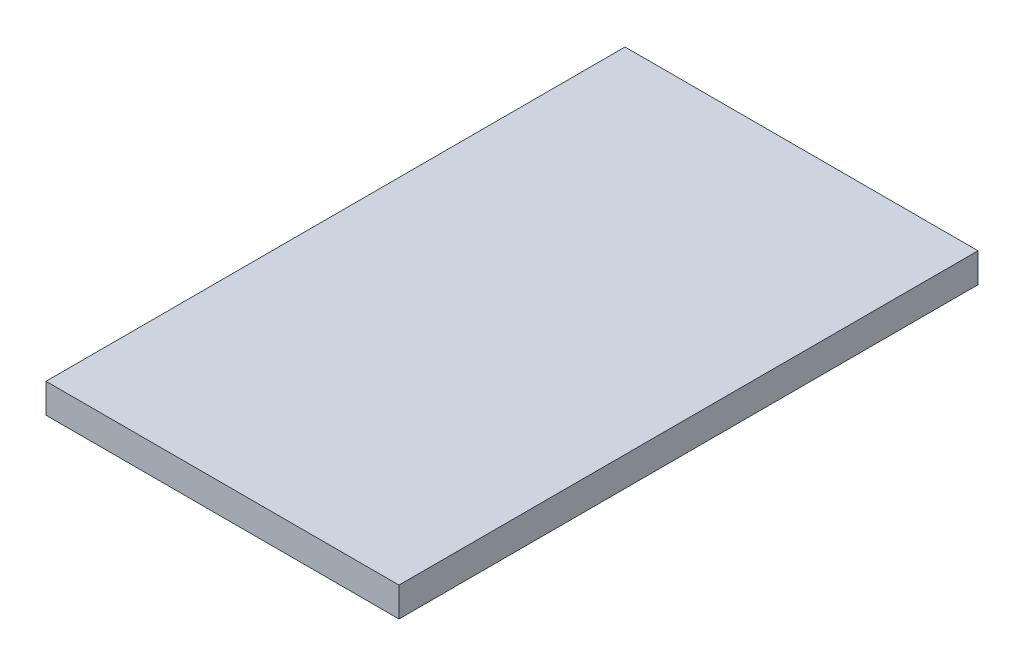
ISO-10303-21;
HEADER;
FILE_DESCRIPTION(('STEP AP214'),'2;1');
FILE_NAME('part.step','',(''),(''),'','','');
FILE_SCHEMA(('AUTOMOTIVE_DESIGN { 1 0 10303 214 1 1 1 1 }'));
ENDSEC;
DATA;
#1=APPLICATION_CONTEXT('core data for automotive mechanical design processes');
#2=APPLICATION_PROTOCOL_DEFINITION('international standard','automotive_design',2000,#1);
#3=PRODUCT_CONTEXT('',#1,'mechanical');
#4=PRODUCT('Part','Part','',(#3));
#5=PRODUCT_RELATED_PRODUCT_CATEGORY('part','',(#4));
#6=PRODUCT_DEFINITION_FORMATION('','',#4);
#7=PRODUCT_DEFINITION_CONTEXT('part definition',#1,'design');
#8=PRODUCT_DEFINITION('design','',#6,#7);
#9=PRODUCT_DEFINITION_SHAPE('','',#8);
#10=(LENGTH_UNIT() NAMED_UNIT(*) SI_UNIT(.MILLI.,.METRE.));
#11=(NAMED_UNIT(*) PLANE_ANGLE_UNIT() SI_UNIT($,.RADIAN.));
#12=(NAMED_UNIT(*) SI_UNIT($,.STERADIAN.) SOLID_ANGLE_UNIT());
#13=UNCERTAINTY_MEASURE_WITH_UNIT(LENGTH_MEASURE(1.E-05),#10,'distance_accuracy_value','');
#14=(GEOMETRIC_REPRESENTATION_CONTEXT(3) GLOBAL_UNCERTAINTY_ASSIGNED_CONTEXT((#13)) GLOBAL_UNIT_ASSIGNED_CONTEXT((#10,
#11,#12)) REPRESENTATION_CONTEXT('',''));
#15=CARTESIAN_POINT('',(0.,0.,0.));
#16=DIRECTION('',(0.,0.,1.));
#17=DIRECTION('',(1.,0.,0.));
#18=AXIS2_PLACEMENT_3D('',#15,#16,#17);
#19=CARTESIAN_POINT('',(7.62,0.635,-12.5));
#20=DIRECTION('',(-1.,0.,0.));
#21=DIRECTION('',(0.,0.,1.));
#22=AXIS2_PLACEMENT_3D('',#19,#20,#21);
#23=PLANE('',#22);
#24=DIRECTION('',(0.,0.,-1.));
#25=VECTOR('',#24,1.);
#26=CARTESIAN_POINT('',(7.62,-0.635,-12.5));
#27=LINE('',#26,#25);
#28=CARTESIAN_POINT('',(7.62,-0.635,12.5));
#29=VERTEX_POINT('',#28);
#30=CARTESIAN_POINT('',(7.62,-0.635,-12.5));
#31=VERTEX_POINT('',#30);
#32=EDGE_CURVE('E113',#29,#31,#27,.T.);
#33=ORIENTED_EDGE('',*,*,#32,.T.);
#34=DIRECTION('',(0.,-1.,0.));
#35=VECTOR('',#34,1.);
#36=CARTESIAN_POINT('',(7.62,0.635,-12.5));
#37=LINE('',#36,#35);
#38=CARTESIAN_POINT('',(7.62,0.635,-12.5));
#39=VERTEX_POINT('',#38);
#40=EDGE_CURVE('E11',#39,#31,#37,.T.);
#41=ORIENTED_EDGE('',*,*,#40,.F.);
#42=DIRECTION('',(0.,0.,-1.));
#43=VECTOR('',#42,1.);
#44=CARTESIAN_POINT('',(7.62,0.635,-12.5));
#45=LINE('',#44,#43);
#46=CARTESIAN_POINT('',(7.62,0.635,12.5));
#47=VERTEX_POINT('',#46);
#48=EDGE_CURVE('E97',#47,#39,#45,.T.);
#49=ORIENTED_EDGE('',*,*,#48,.F.);
#50=DIRECTION('',(0.,-1.,0.));
#51=VECTOR('',#50,1.);
#52=CARTESIAN_POINT('',(7.62,0.635,12.5));
#53=LINE('',#52,#51);
#54=EDGE_CURVE('E109',#47,#29,#53,.T.);
#55=ORIENTED_EDGE('',*,*,#54,.T.);
#56=EDGE_LOOP('',(#33,#41,#49,#55));
#57=FACE_BOUND('',#56,.T.);
#58=ADVANCED_FACE('F45',(#57),#23,.F.);
#59=CARTESIAN_POINT('',(-7.62,0.635,-12.5));
#60=DIRECTION('',(0.,0.,1.));
#61=DIRECTION('',(1.,0.,0.));
#62=AXIS2_PLACEMENT_3D('',#59,#60,#61);
#63=PLANE('',#62);
#64=DIRECTION('',(-1.,0.,0.));
#65=VECTOR('',#64,1.);
#66=CARTESIAN_POINT('',(-7.62,-0.635,-12.5));
#67=LINE('',#66,#65);
#68=CARTESIAN_POINT('',(-7.62,-0.635,-12.5));
#69=VERTEX_POINT('',#68);
#70=EDGE_CURVE('E102',#31,#69,#67,.T.);
#71=ORIENTED_EDGE('',*,*,#70,.T.);
#72=DIRECTION('',(0.,-1.,0.));
#73=VECTOR('',#72,1.);
#74=CARTESIAN_POINT('',(-7.62,0.635,-12.5));
#75=LINE('',#74,#73);
#76=CARTESIAN_POINT('',(-7.62,0.635,-12.5));
#77=VERTEX_POINT('',#76);
#78=EDGE_CURVE('E54',#77,#69,#75,.T.);
#79=ORIENTED_EDGE('',*,*,#78,.F.);
#80=DIRECTION('',(-1.,0.,0.));
#81=VECTOR('',#80,1.);
#82=CARTESIAN_POINT('',(-7.62,0.635,-12.5));
#83=LINE('',#82,#81);
#84=EDGE_CURVE('E92',#39,#77,#83,.T.);
#85=ORIENTED_EDGE('',*,*,#84,.F.);
#86=ORIENTED_EDGE('',*,*,#40,.T.);
#87=EDGE_LOOP('',(#71,#79,#85,#86));
#88=FACE_BOUND('',#87,.T.);
#89=ADVANCED_FACE('F101',(#88),#63,.F.);
#90=CARTESIAN_POINT('',(-7.62,0.635,-12.5));
#91=DIRECTION('',(1.,0.,0.));
#92=DIRECTION('',(0.,0.,-1.));
#93=AXIS2_PLACEMENT_3D('',#90,#91,#92);
#94=PLANE('',#93);
#95=DIRECTION('',(0.,0.,1.));
#96=VECTOR('',#95,1.);
#97=CARTESIAN_POINT('',(-7.62,-0.635,-12.5));
#98=LINE('',#97,#96);
#99=CARTESIAN_POINT('',(-7.62,-0.635,12.5));
#100=VERTEX_POINT('',#99);
#101=EDGE_CURVE('E79',#69,#100,#98,.T.);
#102=ORIENTED_EDGE('',*,*,#101,.T.);
#103=DIRECTION('',(0.,-1.,0.));
#104=VECTOR('',#103,1.);
#105=CARTESIAN_POINT('',(-7.62,0.635,12.5));
#106=LINE('',#105,#104);
#107=CARTESIAN_POINT('',(-7.62,0.635,12.5));
#108=VERTEX_POINT('',#107);
#109=EDGE_CURVE('E104',#108,#100,#106,.T.);
#110=ORIENTED_EDGE('',*,*,#109,.F.);
#111=DIRECTION('',(0.,0.,1.));
#112=VECTOR('',#111,1.);
#113=CARTESIAN_POINT('',(-7.62,0.635,-12.5));
#114=LINE('',#113,#112);
#115=EDGE_CURVE('E95',#77,#108,#114,.T.);
#116=ORIENTED_EDGE('',*,*,#115,.F.);
#117=ORIENTED_EDGE('',*,*,#78,.T.);
#118=EDGE_LOOP('',(#102,#110,#116,#117));
#119=FACE_BOUND('',#118,.T.);
#120=ADVANCED_FACE('F105',(#119),#94,.F.);
#121=CARTESIAN_POINT('',(-7.62,0.635,12.5));
#122=DIRECTION('',(0.,0.,-1.));
#123=DIRECTION('',(-1.,0.,0.));
#124=AXIS2_PLACEMENT_3D('',#121,#122,#123);
#125=PLANE('',#124);
#126=DIRECTION('',(1.,0.,0.));
#127=VECTOR('',#126,1.);
#128=CARTESIAN_POINT('',(-7.62,-0.635,12.5));
#129=LINE('',#128,#127);
#130=EDGE_CURVE('E85',#100,#29,#129,.T.);
#131=ORIENTED_EDGE('',*,*,#130,.T.);
#132=ORIENTED_EDGE('',*,*,#54,.F.);
#133=DIRECTION('',(1.,0.,0.));
#134=VECTOR('',#133,1.);
#135=CARTESIAN_POINT('',(-7.62,0.635,12.5));
#136=LINE('',#135,#134);
#137=EDGE_CURVE('E62',#108,#47,#136,.T.);
#138=ORIENTED_EDGE('',*,*,#137,.F.);
#139=ORIENTED_EDGE('',*,*,#109,.T.);
#140=EDGE_LOOP('',(#131,#132,#138,#139));
#141=FACE_BOUND('',#140,.T.);
#142=ADVANCED_FACE('F126',(#141),#125,.F.);
#143=CARTESIAN_POINT('',(0.,0.635,0.));
#144=DIRECTION('',(0.,1.,0.));
#145=DIRECTION('',(0.,0.,1.));
#146=AXIS2_PLACEMENT_3D('',#143,#144,#145);
#147=PLANE('',#146);
#148=ORIENTED_EDGE('',*,*,#48,.T.);
#149=ORIENTED_EDGE('',*,*,#84,.T.);
#150=ORIENTED_EDGE('',*,*,#115,.T.);
#151=ORIENTED_EDGE('',*,*,#137,.T.);
#152=EDGE_LOOP('',(#148,#149,#150,#151));
#153=FACE_BOUND('',#152,.T.);
#154=ADVANCED_FACE('F93',(#153),#147,.T.);
#155=CARTESIAN_POINT('',(0.,-0.635,0.));
#156=DIRECTION('',(0.,1.,0.));
#157=DIRECTION('',(0.,0.,1.));
#158=AXIS2_PLACEMENT_3D('',#155,#156,#157);
#159=PLANE('',#158);
#160=ORIENTED_EDGE('',*,*,#32,.F.);
#161=ORIENTED_EDGE('',*,*,#130,.F.);
#162=ORIENTED_EDGE('',*,*,#101,.F.);
#163=ORIENTED_EDGE('',*,*,#70,.F.);
#164=EDGE_LOOP('',(#160,#161,#162,#163));
#165=FACE_BOUND('',#164,.T.);
#166=ADVANCED_FACE('F129',(#165),#159,.F.);
#167=CLOSED_SHELL('',(#58,#89,#120,#142,#154,#166));
#168=MANIFOLD_SOLID_BREP('B2',#167);
#169=ADVANCED_BREP_SHAPE_REPRESENTATION('',(#18,#168),#14);
#170=SHAPE_DEFINITION_REPRESENTATION(#9,#169);
ENDSEC;
END-ISO-10303-21;
